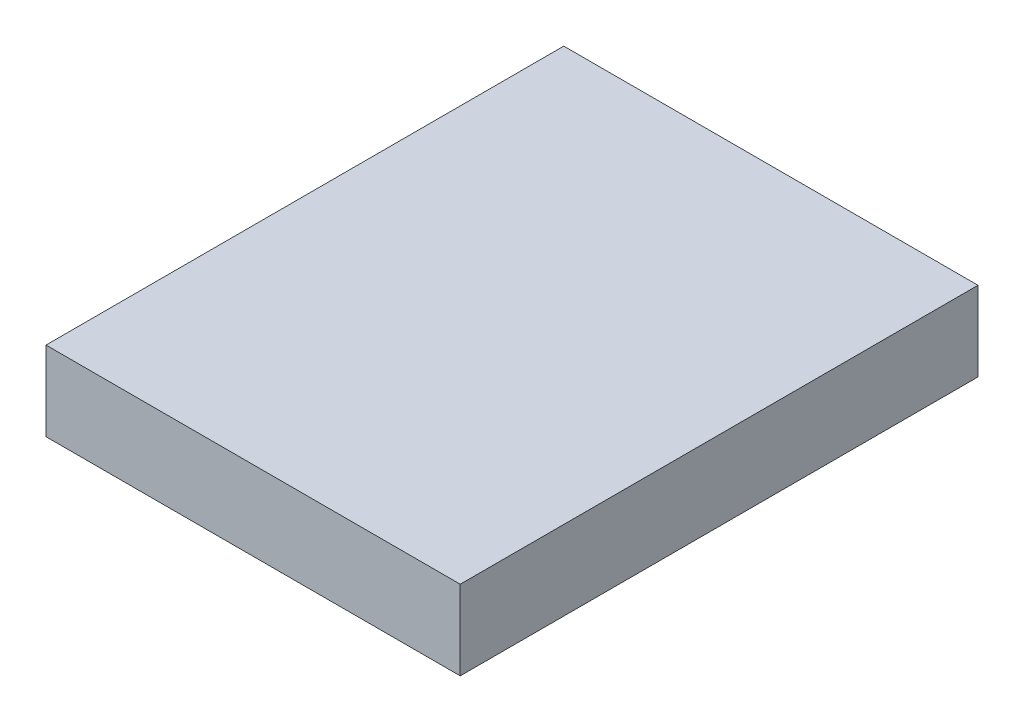
ISO-10303-21;
HEADER;
FILE_DESCRIPTION(('STEP AP214'),'2;1');
FILE_NAME('part.step','',(''),(''),'','','');
FILE_SCHEMA(('AUTOMOTIVE_DESIGN { 1 0 10303 214 1 1 1 1 }'));
ENDSEC;
DATA;
#1=APPLICATION_CONTEXT('core data for automotive mechanical design processes');
#2=APPLICATION_PROTOCOL_DEFINITION('international standard','automotive_design',2000,#1);
#3=PRODUCT_CONTEXT('',#1,'mechanical');
#4=PRODUCT('Part','Part','',(#3));
#5=PRODUCT_RELATED_PRODUCT_CATEGORY('part','',(#4));
#6=PRODUCT_DEFINITION_FORMATION('','',#4);
#7=PRODUCT_DEFINITION_CONTEXT('part definition',#1,'design');
#8=PRODUCT_DEFINITION('design','',#6,#7);
#9=PRODUCT_DEFINITION_SHAPE('','',#8);
#10=(LENGTH_UNIT() NAMED_UNIT(*) SI_UNIT(.MILLI.,.METRE.));
#11=(NAMED_UNIT(*) PLANE_ANGLE_UNIT() SI_UNIT($,.RADIAN.));
#12=(NAMED_UNIT(*) SI_UNIT($,.STERADIAN.) SOLID_ANGLE_UNIT());
#13=UNCERTAINTY_MEASURE_WITH_UNIT(LENGTH_MEASURE(1.E-05),#10,'distance_accuracy_value','');
#14=(GEOMETRIC_REPRESENTATION_CONTEXT(3) GLOBAL_UNCERTAINTY_ASSIGNED_CONTEXT((#13)) GLOBAL_UNIT_ASSIGNED_CONTEXT((#10,
#11,#12)) REPRESENTATION_CONTEXT('',''));
#15=CARTESIAN_POINT('',(0.,0.,0.));
#16=DIRECTION('',(0.,0.,1.));
#17=DIRECTION('',(1.,0.,0.));
#18=AXIS2_PLACEMENT_3D('',#15,#16,#17);
#19=CARTESIAN_POINT('',(0.,2.6,0.));
#20=DIRECTION('',(0.,-1.,0.));
#21=DIRECTION('',(0.,0.,-1.));
#22=AXIS2_PLACEMENT_3D('',#19,#20,#21);
#23=PLANE('',#22);
#24=DIRECTION('',(0.,0.,1.));
#25=VECTOR('',#24,1.);
#26=CARTESIAN_POINT('',(-18.9,2.6,-11.65));
#27=LINE('',#26,#25);
#28=CARTESIAN_POINT('',(-18.9,2.6,-26.65));
#29=VERTEX_POINT('',#28);
#30=CARTESIAN_POINT('',(-18.9,2.6,-11.65));
#31=VERTEX_POINT('',#30);
#32=EDGE_CURVE('E80',#29,#31,#27,.T.);
#33=ORIENTED_EDGE('',*,*,#32,.F.);
#34=DIRECTION('',(-1.,0.,0.));
#35=VECTOR('',#34,1.);
#36=CARTESIAN_POINT('',(-18.9,2.6,-26.65));
#37=LINE('',#36,#35);
#38=CARTESIAN_POINT('',(-6.9,2.6,-26.65));
#39=VERTEX_POINT('',#38);
#40=EDGE_CURVE('E20',#39,#29,#37,.T.);
#41=ORIENTED_EDGE('',*,*,#40,.F.);
#42=DIRECTION('',(0.,0.,-1.));
#43=VECTOR('',#42,1.);
#44=CARTESIAN_POINT('',(-6.9,2.6,-11.65));
#45=LINE('',#44,#43);
#46=CARTESIAN_POINT('',(-6.9,2.6,-11.65));
#47=VERTEX_POINT('',#46);
#48=EDGE_CURVE('E109',#47,#39,#45,.T.);
#49=ORIENTED_EDGE('',*,*,#48,.F.);
#50=DIRECTION('',(1.,0.,0.));
#51=VECTOR('',#50,1.);
#52=CARTESIAN_POINT('',(-18.9,2.6,-11.65));
#53=LINE('',#52,#51);
#54=EDGE_CURVE('E84',#31,#47,#53,.T.);
#55=ORIENTED_EDGE('',*,*,#54,.F.);
#56=EDGE_LOOP('',(#33,#41,#49,#55));
#57=FACE_BOUND('',#56,.T.);
#58=ADVANCED_FACE('F17',(#57),#23,.T.);
#59=CARTESIAN_POINT('',(0.,4.9,0.));
#60=DIRECTION('',(0.,-1.,0.));
#61=DIRECTION('',(0.,0.,-1.));
#62=AXIS2_PLACEMENT_3D('',#59,#60,#61);
#63=PLANE('',#62);
#64=DIRECTION('',(0.,0.,1.));
#65=VECTOR('',#64,1.);
#66=CARTESIAN_POINT('',(-18.9,4.9,-11.65));
#67=LINE('',#66,#65);
#68=CARTESIAN_POINT('',(-18.9,4.9,-26.65));
#69=VERTEX_POINT('',#68);
#70=CARTESIAN_POINT('',(-18.9,4.9,-11.65));
#71=VERTEX_POINT('',#70);
#72=EDGE_CURVE('E82',#69,#71,#67,.T.);
#73=ORIENTED_EDGE('',*,*,#72,.T.);
#74=DIRECTION('',(1.,0.,0.));
#75=VECTOR('',#74,1.);
#76=CARTESIAN_POINT('',(-18.9,4.9,-11.65));
#77=LINE('',#76,#75);
#78=CARTESIAN_POINT('',(-6.9,4.9,-11.65));
#79=VERTEX_POINT('',#78);
#80=EDGE_CURVE('E105',#71,#79,#77,.T.);
#81=ORIENTED_EDGE('',*,*,#80,.T.);
#82=DIRECTION('',(0.,0.,-1.));
#83=VECTOR('',#82,1.);
#84=CARTESIAN_POINT('',(-6.9,4.9,-11.65));
#85=LINE('',#84,#83);
#86=CARTESIAN_POINT('',(-6.9,4.9,-26.65));
#87=VERTEX_POINT('',#86);
#88=EDGE_CURVE('E75',#79,#87,#85,.T.);
#89=ORIENTED_EDGE('',*,*,#88,.T.);
#90=DIRECTION('',(-1.,0.,0.));
#91=VECTOR('',#90,1.);
#92=CARTESIAN_POINT('',(-18.9,4.9,-26.65));
#93=LINE('',#92,#91);
#94=EDGE_CURVE('E11',#87,#69,#93,.T.);
#95=ORIENTED_EDGE('',*,*,#94,.T.);
#96=EDGE_LOOP('',(#73,#81,#89,#95));
#97=FACE_BOUND('',#96,.T.);
#98=ADVANCED_FACE('F117',(#97),#63,.F.);
#99=CARTESIAN_POINT('',(-18.9,4.9,-26.65));
#100=DIRECTION('',(0.,0.,1.));
#101=DIRECTION('',(1.,0.,0.));
#102=AXIS2_PLACEMENT_3D('',#99,#100,#101);
#103=PLANE('',#102);
#104=ORIENTED_EDGE('',*,*,#40,.T.);
#105=DIRECTION('',(0.,-1.,0.));
#106=VECTOR('',#105,1.);
#107=CARTESIAN_POINT('',(-18.9,4.9,-26.65));
#108=LINE('',#107,#106);
#109=EDGE_CURVE('E69',#69,#29,#108,.T.);
#110=ORIENTED_EDGE('',*,*,#109,.F.);
#111=ORIENTED_EDGE('',*,*,#94,.F.);
#112=DIRECTION('',(0.,-1.,0.));
#113=VECTOR('',#112,1.);
#114=CARTESIAN_POINT('',(-6.9,4.9,-26.65));
#115=LINE('',#114,#113);
#116=EDGE_CURVE('E72',#87,#39,#115,.T.);
#117=ORIENTED_EDGE('',*,*,#116,.T.);
#118=EDGE_LOOP('',(#104,#110,#111,#117));
#119=FACE_BOUND('',#118,.T.);
#120=ADVANCED_FACE('F68',(#119),#103,.F.);
#121=CARTESIAN_POINT('',(-6.9,4.9,-11.65));
#122=DIRECTION('',(-1.,0.,0.));
#123=DIRECTION('',(0.,0.,1.));
#124=AXIS2_PLACEMENT_3D('',#121,#122,#123);
#125=PLANE('',#124);
#126=ORIENTED_EDGE('',*,*,#48,.T.);
#127=ORIENTED_EDGE('',*,*,#116,.F.);
#128=ORIENTED_EDGE('',*,*,#88,.F.);
#129=DIRECTION('',(0.,-1.,0.));
#130=VECTOR('',#129,1.);
#131=CARTESIAN_POINT('',(-6.9,4.9,-11.65));
#132=LINE('',#131,#130);
#133=EDGE_CURVE('E101',#79,#47,#132,.T.);
#134=ORIENTED_EDGE('',*,*,#133,.T.);
#135=EDGE_LOOP('',(#126,#127,#128,#134));
#136=FACE_BOUND('',#135,.T.);
#137=ADVANCED_FACE('F120',(#136),#125,.F.);
#138=CARTESIAN_POINT('',(-18.9,4.9,-11.65));
#139=DIRECTION('',(0.,0.,-1.));
#140=DIRECTION('',(0.,-1.,0.));
#141=AXIS2_PLACEMENT_3D('',#138,#139,#140);
#142=PLANE('',#141);
#143=ORIENTED_EDGE('',*,*,#54,.T.);
#144=ORIENTED_EDGE('',*,*,#133,.F.);
#145=ORIENTED_EDGE('',*,*,#80,.F.);
#146=DIRECTION('',(0.,-1.,0.));
#147=VECTOR('',#146,1.);
#148=CARTESIAN_POINT('',(-18.9,4.9,-11.65));
#149=LINE('',#148,#147);
#150=EDGE_CURVE('E89',#71,#31,#149,.T.);
#151=ORIENTED_EDGE('',*,*,#150,.T.);
#152=EDGE_LOOP('',(#143,#144,#145,#151));
#153=FACE_BOUND('',#152,.T.);
#154=ADVANCED_FACE('F122',(#153),#142,.F.);
#155=CARTESIAN_POINT('',(-18.9,4.9,-11.65));
#156=DIRECTION('',(1.,0.,0.));
#157=DIRECTION('',(0.,1.,0.));
#158=AXIS2_PLACEMENT_3D('',#155,#156,#157);
#159=PLANE('',#158);
#160=ORIENTED_EDGE('',*,*,#32,.T.);
#161=ORIENTED_EDGE('',*,*,#150,.F.);
#162=ORIENTED_EDGE('',*,*,#72,.F.);
#163=ORIENTED_EDGE('',*,*,#109,.T.);
#164=EDGE_LOOP('',(#160,#161,#162,#163));
#165=FACE_BOUND('',#164,.T.);
#166=ADVANCED_FACE('F78',(#165),#159,.F.);
#167=CLOSED_SHELL('',(#58,#98,#120,#137,#154,#166));
#168=MANIFOLD_SOLID_BREP('B1',#167);
#169=ADVANCED_BREP_SHAPE_REPRESENTATION('',(#18,#168),#14);
#170=SHAPE_DEFINITION_REPRESENTATION(#9,#169);
ENDSEC;
END-ISO-10303-21;
